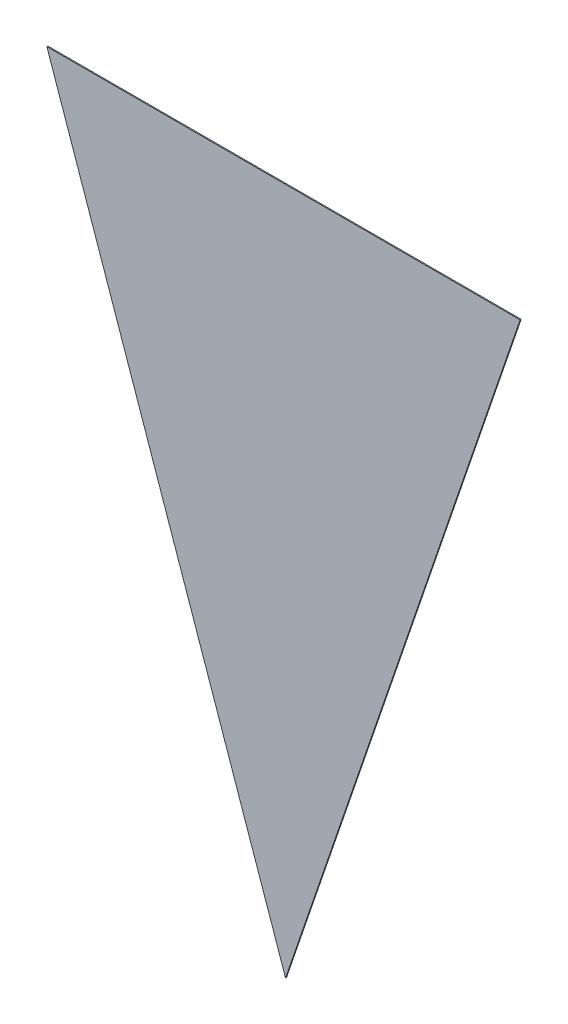
ISO-10303-21;
HEADER;
FILE_DESCRIPTION(('STEP AP214'),'2;1');
FILE_NAME('part.step','',(''),(''),'','','');
FILE_SCHEMA(('AUTOMOTIVE_DESIGN { 1 0 10303 214 1 1 1 1 }'));
ENDSEC;
DATA;
#1=APPLICATION_CONTEXT('core data for automotive mechanical design processes');
#2=APPLICATION_PROTOCOL_DEFINITION('international standard','automotive_design',2000,#1);
#3=PRODUCT_CONTEXT('',#1,'mechanical');
#4=PRODUCT('Part','Part','',(#3));
#5=PRODUCT_RELATED_PRODUCT_CATEGORY('part','',(#4));
#6=PRODUCT_DEFINITION_FORMATION('','',#4);
#7=PRODUCT_DEFINITION_CONTEXT('part definition',#1,'design');
#8=PRODUCT_DEFINITION('design','',#6,#7);
#9=PRODUCT_DEFINITION_SHAPE('','',#8);
#10=(LENGTH_UNIT() NAMED_UNIT(*) SI_UNIT(.MILLI.,.METRE.));
#11=(NAMED_UNIT(*) PLANE_ANGLE_UNIT() SI_UNIT($,.RADIAN.));
#12=(NAMED_UNIT(*) SI_UNIT($,.STERADIAN.) SOLID_ANGLE_UNIT());
#13=UNCERTAINTY_MEASURE_WITH_UNIT(LENGTH_MEASURE(1.E-05),#10,'distance_accuracy_value','');
#14=(GEOMETRIC_REPRESENTATION_CONTEXT(3) GLOBAL_UNCERTAINTY_ASSIGNED_CONTEXT((#13)) GLOBAL_UNIT_ASSIGNED_CONTEXT((#10,
#11,#12)) REPRESENTATION_CONTEXT('',''));
#15=CARTESIAN_POINT('',(0.,0.,0.));
#16=DIRECTION('',(0.,0.,1.));
#17=DIRECTION('',(1.,0.,0.));
#18=AXIS2_PLACEMENT_3D('',#15,#16,#17);
#19=CARTESIAN_POINT('',(0.,0.,0.001));
#20=DIRECTION('',(0.,0.,1.));
#21=DIRECTION('',(1.,0.,0.));
#22=AXIS2_PLACEMENT_3D('',#19,#20,#21);
#23=PLANE('',#22);
#24=DIRECTION('',(1.,0.,0.));
#25=VECTOR('',#24,1.);
#26=CARTESIAN_POINT('',(-1.986435503757,0.09655880937196,0.001));
#27=LINE('',#26,#25);
#28=CARTESIAN_POINT('',(-1.524995088769,0.09655880937196,0.001));
#29=VERTEX_POINT('',#28);
#30=CARTESIAN_POINT('',(-1.98643550375714,0.09655880937196,0.001));
#31=VERTEX_POINT('',#30);
#32=EDGE_CURVE('E50',#29,#31,#27,.F.);
#33=ORIENTED_EDGE('',*,*,#32,.T.);
#34=DIRECTION('',(-0.328093701568025,0.944645183649073,0.));
#35=VECTOR('',#34,1.);
#36=CARTESIAN_POINT('',(-1.753717569353,-0.573481105546,0.001));
#37=LINE('',#36,#35);
#38=CARTESIAN_POINT('',(-1.75371756935287,-0.573481105546379,0.001));
#39=VERTEX_POINT('',#38);
#40=EDGE_CURVE('E48',#31,#39,#37,.F.);
#41=ORIENTED_EDGE('',*,*,#40,.T.);
#42=DIRECTION('',(-0.323053235934926,-0.946380793735784,0.));
#43=VECTOR('',#42,1.);
#44=CARTESIAN_POINT('',(-1.524995088769,0.09655880937196,0.001));
#45=LINE('',#44,#43);
#46=EDGE_CURVE('E51',#39,#29,#45,.F.);
#47=ORIENTED_EDGE('',*,*,#46,.T.);
#48=EDGE_LOOP('',(#33,#41,#47));
#49=FACE_BOUND('',#48,.T.);
#50=ADVANCED_FACE('F17',(#49),#23,.T.);
#51=CARTESIAN_POINT('',(-1.986435503757,0.09655880937196,0.001));
#52=DIRECTION('',(0.,-1.,0.));
#53=DIRECTION('',(0.,0.,-1.));
#54=AXIS2_PLACEMENT_3D('',#51,#52,#53);
#55=PLANE('',#54);
#56=DIRECTION('',(0.,0.,-1.));
#57=VECTOR('',#56,1.);
#58=CARTESIAN_POINT('',(-1.986435503757,0.09655880937196,0.001));
#59=LINE('',#58,#57);
#60=CARTESIAN_POINT('',(-1.986435503757,0.09655880937196,0.));
#61=VERTEX_POINT('',#60);
#62=EDGE_CURVE('E20',#61,#31,#59,.F.);
#63=ORIENTED_EDGE('',*,*,#62,.T.);
#64=ORIENTED_EDGE('',*,*,#32,.F.);
#65=DIRECTION('',(0.,0.,-1.));
#66=VECTOR('',#65,1.);
#67=CARTESIAN_POINT('',(-1.524995088769,0.09655880937196,0.001));
#68=LINE('',#67,#66);
#69=CARTESIAN_POINT('',(-1.524995088769,0.0965588093719601,0.));
#70=VERTEX_POINT('',#69);
#71=EDGE_CURVE('E66',#29,#70,#68,.T.);
#72=ORIENTED_EDGE('',*,*,#71,.T.);
#73=DIRECTION('',(1.,0.,0.));
#74=VECTOR('',#73,1.);
#75=CARTESIAN_POINT('',(0.,0.09655880937196,0.));
#76=LINE('',#75,#74);
#77=EDGE_CURVE('E65',#70,#61,#76,.F.);
#78=ORIENTED_EDGE('',*,*,#77,.T.);
#79=EDGE_LOOP('',(#63,#64,#72,#78));
#80=FACE_BOUND('',#79,.T.);
#81=ADVANCED_FACE('F63',(#80),#55,.F.);
#82=CARTESIAN_POINT('',(-1.753717569353,-0.573481105546,0.001));
#83=DIRECTION('',(0.944645183649073,0.328093701568025,0.));
#84=DIRECTION('',(-0.328093701568025,0.944645183649073,0.));
#85=AXIS2_PLACEMENT_3D('',#82,#83,#84);
#86=PLANE('',#85);
#87=DIRECTION('',(0.,0.,1.));
#88=VECTOR('',#87,1.);
#89=CARTESIAN_POINT('',(-1.753717569353,-0.573481105546,0.001));
#90=LINE('',#89,#88);
#91=CARTESIAN_POINT('',(-1.753717569353,-0.573481105546,0.));
#92=VERTEX_POINT('',#91);
#93=EDGE_CURVE('E34',#92,#39,#90,.T.);
#94=ORIENTED_EDGE('',*,*,#93,.T.);
#95=ORIENTED_EDGE('',*,*,#40,.F.);
#96=ORIENTED_EDGE('',*,*,#62,.F.);
#97=DIRECTION('',(0.328093701567681,-0.944645183649193,0.));
#98=VECTOR('',#97,1.);
#99=CARTESIAN_POINT('',(-1.986435503757,0.09655880937196,0.));
#100=LINE('',#99,#98);
#101=EDGE_CURVE('E26',#61,#92,#100,.T.);
#102=ORIENTED_EDGE('',*,*,#101,.T.);
#103=EDGE_LOOP('',(#94,#95,#96,#102));
#104=FACE_BOUND('',#103,.T.);
#105=ADVANCED_FACE('F58',(#104),#86,.F.);
#106=CARTESIAN_POINT('',(-1.524995088769,0.09655880937196,0.001));
#107=DIRECTION('',(-0.946380793735784,0.323053235934926,0.));
#108=DIRECTION('',(-0.323053235934926,-0.946380793735784,0.));
#109=AXIS2_PLACEMENT_3D('',#106,#107,#108);
#110=PLANE('',#109);
#111=ORIENTED_EDGE('',*,*,#71,.F.);
#112=ORIENTED_EDGE('',*,*,#46,.F.);
#113=ORIENTED_EDGE('',*,*,#93,.F.);
#114=DIRECTION('',(0.323053235935586,0.946380793735559,0.));
#115=VECTOR('',#114,1.);
#116=CARTESIAN_POINT('',(-1.753717569353,-0.573481105546,0.));
#117=LINE('',#116,#115);
#118=EDGE_CURVE('E11',#92,#70,#117,.T.);
#119=ORIENTED_EDGE('',*,*,#118,.T.);
#120=EDGE_LOOP('',(#111,#112,#113,#119));
#121=FACE_BOUND('',#120,.T.);
#122=ADVANCED_FACE('F73',(#121),#110,.F.);
#123=CARTESIAN_POINT('',(0.,0.,0.));
#124=DIRECTION('',(0.,0.,1.));
#125=DIRECTION('',(1.,0.,0.));
#126=AXIS2_PLACEMENT_3D('',#123,#124,#125);
#127=PLANE('',#126);
#128=ORIENTED_EDGE('',*,*,#101,.F.);
#129=ORIENTED_EDGE('',*,*,#77,.F.);
#130=ORIENTED_EDGE('',*,*,#118,.F.);
#131=EDGE_LOOP('',(#128,#129,#130));
#132=FACE_BOUND('',#131,.T.);
#133=ADVANCED_FACE('F72',(#132),#127,.F.);
#134=CLOSED_SHELL('',(#50,#81,#105,#122,#133));
#135=MANIFOLD_SOLID_BREP('B1',#134);
#136=ADVANCED_BREP_SHAPE_REPRESENTATION('',(#18,#135),#14);
#137=SHAPE_DEFINITION_REPRESENTATION(#9,#136);
ENDSEC;
END-ISO-10303-21;
